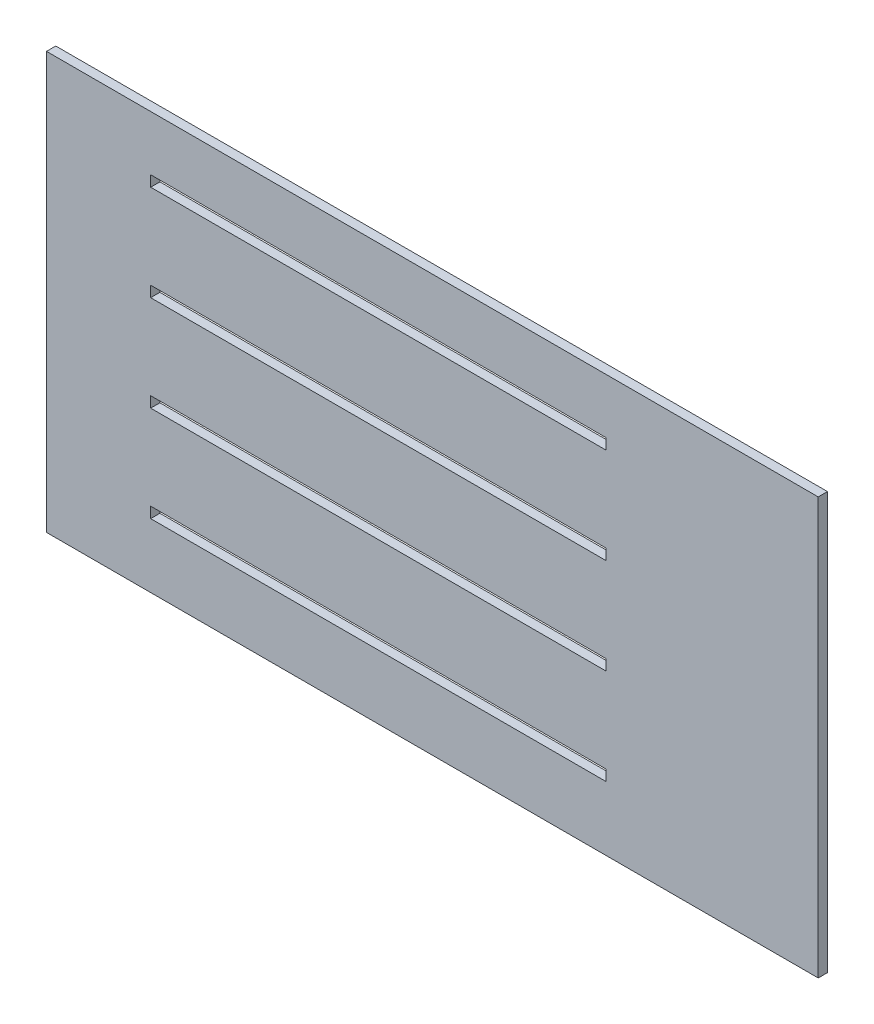
ISO-10303-21;
HEADER;
FILE_DESCRIPTION(('STEP AP214'),'2;1');
FILE_NAME('part.step','',(''),(''),'','','');
FILE_SCHEMA(('AUTOMOTIVE_DESIGN { 1 0 10303 214 1 1 1 1 }'));
ENDSEC;
DATA;
#1=APPLICATION_CONTEXT('core data for automotive mechanical design processes');
#2=APPLICATION_PROTOCOL_DEFINITION('international standard','automotive_design',2000,#1);
#3=PRODUCT_CONTEXT('',#1,'mechanical');
#4=PRODUCT('Part','Part','',(#3));
#5=PRODUCT_RELATED_PRODUCT_CATEGORY('part','',(#4));
#6=PRODUCT_DEFINITION_FORMATION('','',#4);
#7=PRODUCT_DEFINITION_CONTEXT('part definition',#1,'design');
#8=PRODUCT_DEFINITION('design','',#6,#7);
#9=PRODUCT_DEFINITION_SHAPE('','',#8);
#10=(LENGTH_UNIT() NAMED_UNIT(*) SI_UNIT(.MILLI.,.METRE.));
#11=(NAMED_UNIT(*) PLANE_ANGLE_UNIT() SI_UNIT($,.RADIAN.));
#12=(NAMED_UNIT(*) SI_UNIT($,.STERADIAN.) SOLID_ANGLE_UNIT());
#13=UNCERTAINTY_MEASURE_WITH_UNIT(LENGTH_MEASURE(1.E-05),#10,'distance_accuracy_value','');
#14=(GEOMETRIC_REPRESENTATION_CONTEXT(3) GLOBAL_UNCERTAINTY_ASSIGNED_CONTEXT((#13)) GLOBAL_UNIT_ASSIGNED_CONTEXT((#10,
#11,#12)) REPRESENTATION_CONTEXT('',''));
#15=CARTESIAN_POINT('',(0.,0.,0.));
#16=DIRECTION('',(0.,0.,1.));
#17=DIRECTION('',(1.,0.,0.));
#18=AXIS2_PLACEMENT_3D('',#15,#16,#17);
#19=CARTESIAN_POINT('',(-67.1671018276763,76.2297650130549,-3.));
#20=DIRECTION('',(0.,-1.,0.));
#21=DIRECTION('',(0.,0.,-1.));
#22=AXIS2_PLACEMENT_3D('',#19,#20,#21);
#23=PLANE('',#22);
#24=DIRECTION('',(1.,0.,0.));
#25=VECTOR('',#24,1.);
#26=CARTESIAN_POINT('',(-67.1671018276763,76.2297650130549,0.));
#27=LINE('',#26,#25);
#28=CARTESIAN_POINT('',(-101.167101827676,76.2297650130549,0.));
#29=VERTEX_POINT('',#28);
#30=CARTESIAN_POINT('',(148.894045329306,76.2297650130549,0.));
#31=VERTEX_POINT('',#30);
#32=EDGE_CURVE('E200',#29,#31,#27,.T.);
#33=ORIENTED_EDGE('',*,*,#32,.T.);
#34=DIRECTION('',(0.,0.,1.));
#35=VECTOR('',#34,1.);
#36=CARTESIAN_POINT('',(148.894045329306,76.2297650130549,-3.));
#37=LINE('',#36,#35);
#38=CARTESIAN_POINT('',(148.894045329306,76.2297650130549,-3.));
#39=VERTEX_POINT('',#38);
#40=EDGE_CURVE('E197',#39,#31,#37,.T.);
#41=ORIENTED_EDGE('',*,*,#40,.F.);
#42=DIRECTION('',(-1.,0.,0.));
#43=VECTOR('',#42,1.);
#44=CARTESIAN_POINT('',(-67.1671018276763,76.2297650130549,-3.));
#45=LINE('',#44,#43);
#46=CARTESIAN_POINT('',(-101.167101827676,76.2297650130549,-3.));
#47=VERTEX_POINT('',#46);
#48=EDGE_CURVE('E190',#39,#47,#45,.T.);
#49=ORIENTED_EDGE('',*,*,#48,.T.);
#50=DIRECTION('',(0.,0.,1.));
#51=VECTOR('',#50,1.);
#52=CARTESIAN_POINT('',(-101.167101827676,76.2297650130549,-3.));
#53=LINE('',#52,#51);
#54=EDGE_CURVE('E186',#47,#29,#53,.T.);
#55=ORIENTED_EDGE('',*,*,#54,.T.);
#56=EDGE_LOOP('',(#33,#41,#49,#55));
#57=FACE_BOUND('',#56,.T.);
#58=ADVANCED_FACE('F33',(#57),#23,.F.);
#59=CARTESIAN_POINT('',(148.894045329306,76.2297650130549,-3.));
#60=DIRECTION('',(-1.,0.,0.));
#61=DIRECTION('',(0.,0.,1.));
#62=AXIS2_PLACEMENT_3D('',#59,#60,#61);
#63=PLANE('',#62);
#64=DIRECTION('',(0.,-1.,0.));
#65=VECTOR('',#64,1.);
#66=CARTESIAN_POINT('',(148.894045329306,76.2297650130549,0.));
#67=LINE('',#66,#65);
#68=CARTESIAN_POINT('',(148.894045329306,-58.7702349869451,0.));
#69=VERTEX_POINT('',#68);
#70=EDGE_CURVE('E189',#31,#69,#67,.T.);
#71=ORIENTED_EDGE('',*,*,#70,.T.);
#72=DIRECTION('',(0.,0.,1.));
#73=VECTOR('',#72,1.);
#74=CARTESIAN_POINT('',(148.894045329306,-58.7702349869451,-3.));
#75=LINE('',#74,#73);
#76=CARTESIAN_POINT('',(148.894045329306,-58.7702349869451,-3.));
#77=VERTEX_POINT('',#76);
#78=EDGE_CURVE('E194',#77,#69,#75,.T.);
#79=ORIENTED_EDGE('',*,*,#78,.F.);
#80=DIRECTION('',(0.,-1.,0.));
#81=VECTOR('',#80,1.);
#82=CARTESIAN_POINT('',(148.894045329306,76.2297650130549,-3.));
#83=LINE('',#82,#81);
#84=EDGE_CURVE('E213',#39,#77,#83,.T.);
#85=ORIENTED_EDGE('',*,*,#84,.F.);
#86=ORIENTED_EDGE('',*,*,#40,.T.);
#87=EDGE_LOOP('',(#71,#79,#85,#86));
#88=FACE_BOUND('',#87,.T.);
#89=ADVANCED_FACE('F374',(#88),#63,.F.);
#90=CARTESIAN_POINT('',(79.8940453293061,-58.7702349869451,-3.));
#91=DIRECTION('',(0.,-1.,0.));
#92=DIRECTION('',(0.,0.,-1.));
#93=AXIS2_PLACEMENT_3D('',#90,#91,#92);
#94=PLANE('',#93);
#95=DIRECTION('',(1.,0.,0.));
#96=VECTOR('',#95,1.);
#97=CARTESIAN_POINT('',(79.8940453293061,-58.7702349869451,0.));
#98=LINE('',#97,#96);
#99=CARTESIAN_POINT('',(-101.167101827676,-58.7702349869451,0.));
#100=VERTEX_POINT('',#99);
#101=EDGE_CURVE('E205',#100,#69,#98,.T.);
#102=ORIENTED_EDGE('',*,*,#101,.F.);
#103=DIRECTION('',(0.,0.,1.));
#104=VECTOR('',#103,1.);
#105=CARTESIAN_POINT('',(-101.167101827676,-58.7702349869451,-3.));
#106=LINE('',#105,#104);
#107=CARTESIAN_POINT('',(-101.167101827676,-58.7702349869451,-3.));
#108=VERTEX_POINT('',#107);
#109=EDGE_CURVE('E96',#108,#100,#106,.T.);
#110=ORIENTED_EDGE('',*,*,#109,.F.);
#111=DIRECTION('',(-1.,0.,0.));
#112=VECTOR('',#111,1.);
#113=CARTESIAN_POINT('',(-98.1671018276762,-58.7702349869451,-3.));
#114=LINE('',#113,#112);
#115=EDGE_CURVE('E212',#77,#108,#114,.T.);
#116=ORIENTED_EDGE('',*,*,#115,.F.);
#117=ORIENTED_EDGE('',*,*,#78,.T.);
#118=EDGE_LOOP('',(#102,#110,#116,#117));
#119=FACE_BOUND('',#118,.T.);
#120=ADVANCED_FACE('F380',(#119),#94,.T.);
#121=CARTESIAN_POINT('',(-101.167101827676,76.2297650130549,-3.));
#122=DIRECTION('',(-1.,0.,0.));
#123=DIRECTION('',(0.,-1.,0.));
#124=AXIS2_PLACEMENT_3D('',#121,#122,#123);
#125=PLANE('',#124);
#126=DIRECTION('',(0.,-1.,0.));
#127=VECTOR('',#126,1.);
#128=CARTESIAN_POINT('',(-101.167101827676,76.2297650130549,0.));
#129=LINE('',#128,#127);
#130=EDGE_CURVE('E209',#29,#100,#129,.T.);
#131=ORIENTED_EDGE('',*,*,#130,.F.);
#132=ORIENTED_EDGE('',*,*,#54,.F.);
#133=DIRECTION('',(0.,-1.,0.));
#134=VECTOR('',#133,1.);
#135=CARTESIAN_POINT('',(-101.167101827676,76.2297650130549,-3.));
#136=LINE('',#135,#134);
#137=EDGE_CURVE('E193',#47,#108,#136,.T.);
#138=ORIENTED_EDGE('',*,*,#137,.T.);
#139=ORIENTED_EDGE('',*,*,#109,.T.);
#140=EDGE_LOOP('',(#131,#132,#138,#139));
#141=FACE_BOUND('',#140,.T.);
#142=ADVANCED_FACE('F388',(#141),#125,.T.);
#143=CARTESIAN_POINT('',(0.,0.,-3.));
#144=DIRECTION('',(0.,0.,1.));
#145=DIRECTION('',(1.,0.,0.));
#146=AXIS2_PLACEMENT_3D('',#143,#144,#145);
#147=PLANE('',#146);
#148=DIRECTION('',(-1.,0.,0.));
#149=VECTOR('',#148,1.);
#150=CARTESIAN_POINT('',(-67.4171018276762,27.4797650130548,-3.));
#151=LINE('',#150,#149);
#152=CARTESIAN_POINT('',(80.0828981723238,27.4797650130548,-3.));
#153=VERTEX_POINT('',#152);
#154=CARTESIAN_POINT('',(-67.4171018276762,27.4797650130548,-3.));
#155=VERTEX_POINT('',#154);
#156=EDGE_CURVE('E74',#153,#155,#151,.T.);
#157=ORIENTED_EDGE('',*,*,#156,.T.);
#158=DIRECTION('',(0.,-1.,0.));
#159=VECTOR('',#158,1.);
#160=CARTESIAN_POINT('',(-67.4171018276762,27.4797650130548,-3.));
#161=LINE('',#160,#159);
#162=CARTESIAN_POINT('',(-67.4171018276762,23.9797650130548,-3.));
#163=VERTEX_POINT('',#162);
#164=EDGE_CURVE('E37',#155,#163,#161,.T.);
#165=ORIENTED_EDGE('',*,*,#164,.T.);
#166=DIRECTION('',(1.,0.,0.));
#167=VECTOR('',#166,1.);
#168=CARTESIAN_POINT('',(-67.4171018276762,23.9797650130548,-3.));
#169=LINE('',#168,#167);
#170=CARTESIAN_POINT('',(80.0828981723237,23.9797650130548,-3.));
#171=VERTEX_POINT('',#170);
#172=EDGE_CURVE('E99',#163,#171,#169,.T.);
#173=ORIENTED_EDGE('',*,*,#172,.T.);
#174=DIRECTION('',(0.,1.,0.));
#175=VECTOR('',#174,1.);
#176=CARTESIAN_POINT('',(80.0828981723238,27.4797650130548,-3.));
#177=LINE('',#176,#175);
#178=EDGE_CURVE('E97',#171,#153,#177,.T.);
#179=ORIENTED_EDGE('',*,*,#178,.T.);
#180=EDGE_LOOP('',(#157,#165,#173,#179));
#181=FACE_BOUND('',#180,.T.);
#182=DIRECTION('',(-1.,0.,0.));
#183=VECTOR('',#182,1.);
#184=CARTESIAN_POINT('',(-67.4171018276762,-3.52023498694516,-3.));
#185=LINE('',#184,#183);
#186=CARTESIAN_POINT('',(80.0828981723238,-3.52023498694516,-3.));
#187=VERTEX_POINT('',#186);
#188=CARTESIAN_POINT('',(-67.4171018276762,-3.52023498694516,-3.));
#189=VERTEX_POINT('',#188);
#190=EDGE_CURVE('E98',#187,#189,#185,.T.);
#191=ORIENTED_EDGE('',*,*,#190,.T.);
#192=DIRECTION('',(0.,-1.,0.));
#193=VECTOR('',#192,1.);
#194=CARTESIAN_POINT('',(-67.4171018276762,-3.52023498694516,-3.));
#195=LINE('',#194,#193);
#196=CARTESIAN_POINT('',(-67.4171018276762,-7.02023498694514,-3.));
#197=VERTEX_POINT('',#196);
#198=EDGE_CURVE('E114',#189,#197,#195,.T.);
#199=ORIENTED_EDGE('',*,*,#198,.T.);
#200=DIRECTION('',(1.,0.,0.));
#201=VECTOR('',#200,1.);
#202=CARTESIAN_POINT('',(-67.4171018276762,-7.02023498694514,-3.));
#203=LINE('',#202,#201);
#204=CARTESIAN_POINT('',(80.0828981723237,-7.02023498694514,-3.));
#205=VERTEX_POINT('',#204);
#206=EDGE_CURVE('E117',#197,#205,#203,.T.);
#207=ORIENTED_EDGE('',*,*,#206,.T.);
#208=DIRECTION('',(0.,1.,0.));
#209=VECTOR('',#208,1.);
#210=CARTESIAN_POINT('',(80.0828981723238,-3.52023498694516,-3.));
#211=LINE('',#210,#209);
#212=EDGE_CURVE('E120',#205,#187,#211,.T.);
#213=ORIENTED_EDGE('',*,*,#212,.T.);
#214=EDGE_LOOP('',(#191,#199,#207,#213));
#215=FACE_BOUND('',#214,.T.);
#216=DIRECTION('',(-1.,0.,0.));
#217=VECTOR('',#216,1.);
#218=CARTESIAN_POINT('',(-67.4171018276762,-34.5202349869452,-3.));
#219=LINE('',#218,#217);
#220=CARTESIAN_POINT('',(80.0828981723237,-34.5202349869452,-3.));
#221=VERTEX_POINT('',#220);
#222=CARTESIAN_POINT('',(-67.4171018276762,-34.5202349869452,-3.));
#223=VERTEX_POINT('',#222);
#224=EDGE_CURVE('E123',#221,#223,#219,.T.);
#225=ORIENTED_EDGE('',*,*,#224,.T.);
#226=DIRECTION('',(0.,-1.,0.));
#227=VECTOR('',#226,1.);
#228=CARTESIAN_POINT('',(-67.4171018276762,-34.5202349869452,-3.));
#229=LINE('',#228,#227);
#230=CARTESIAN_POINT('',(-67.4171018276762,-38.0202349869451,-3.));
#231=VERTEX_POINT('',#230);
#232=EDGE_CURVE('E150',#223,#231,#229,.T.);
#233=ORIENTED_EDGE('',*,*,#232,.T.);
#234=DIRECTION('',(1.,0.,0.));
#235=VECTOR('',#234,1.);
#236=CARTESIAN_POINT('',(-67.4171018276762,-38.0202349869451,-3.));
#237=LINE('',#236,#235);
#238=CARTESIAN_POINT('',(80.0828981723237,-38.0202349869451,-3.));
#239=VERTEX_POINT('',#238);
#240=EDGE_CURVE('E153',#231,#239,#237,.T.);
#241=ORIENTED_EDGE('',*,*,#240,.T.);
#242=DIRECTION('',(0.,1.,0.));
#243=VECTOR('',#242,1.);
#244=CARTESIAN_POINT('',(80.0828981723237,-34.5202349869452,-3.));
#245=LINE('',#244,#243);
#246=EDGE_CURVE('E156',#239,#221,#245,.T.);
#247=ORIENTED_EDGE('',*,*,#246,.T.);
#248=EDGE_LOOP('',(#225,#233,#241,#247));
#249=FACE_BOUND('',#248,.T.);
#250=DIRECTION('',(-1.,0.,0.));
#251=VECTOR('',#250,1.);
#252=CARTESIAN_POINT('',(-67.4171018276762,58.4797650130549,-3.));
#253=LINE('',#252,#251);
#254=CARTESIAN_POINT('',(80.0828981723238,58.4797650130549,-3.));
#255=VERTEX_POINT('',#254);
#256=CARTESIAN_POINT('',(-67.4171018276762,58.4797650130549,-3.));
#257=VERTEX_POINT('',#256);
#258=EDGE_CURVE('E159',#255,#257,#253,.T.);
#259=ORIENTED_EDGE('',*,*,#258,.T.);
#260=DIRECTION('',(0.,-1.,0.));
#261=VECTOR('',#260,1.);
#262=CARTESIAN_POINT('',(-67.4171018276762,58.4797650130549,-3.));
#263=LINE('',#262,#261);
#264=CARTESIAN_POINT('',(-67.4171018276762,54.9797650130549,-3.));
#265=VERTEX_POINT('',#264);
#266=EDGE_CURVE('E247',#257,#265,#263,.T.);
#267=ORIENTED_EDGE('',*,*,#266,.T.);
#268=DIRECTION('',(1.,0.,0.));
#269=VECTOR('',#268,1.);
#270=CARTESIAN_POINT('',(-67.4171018276762,54.9797650130549,-3.));
#271=LINE('',#270,#269);
#272=CARTESIAN_POINT('',(80.0828981723237,54.9797650130549,-3.));
#273=VERTEX_POINT('',#272);
#274=EDGE_CURVE('E250',#265,#273,#271,.T.);
#275=ORIENTED_EDGE('',*,*,#274,.T.);
#276=DIRECTION('',(0.,1.,0.));
#277=VECTOR('',#276,1.);
#278=CARTESIAN_POINT('',(80.0828981723238,58.4797650130549,-3.));
#279=LINE('',#278,#277);
#280=EDGE_CURVE('E216',#273,#255,#279,.T.);
#281=ORIENTED_EDGE('',*,*,#280,.T.);
#282=EDGE_LOOP('',(#259,#267,#275,#281));
#283=FACE_BOUND('',#282,.T.);
#284=ORIENTED_EDGE('',*,*,#48,.F.);
#285=ORIENTED_EDGE('',*,*,#84,.T.);
#286=ORIENTED_EDGE('',*,*,#115,.T.);
#287=ORIENTED_EDGE('',*,*,#137,.F.);
#288=EDGE_LOOP('',(#284,#285,#286,#287));
#289=FACE_BOUND('',#288,.T.);
#290=ADVANCED_FACE('F35',(#181,#215,#249,#283,#289),#147,.F.);
#291=CARTESIAN_POINT('',(0.,0.,0.));
#292=DIRECTION('',(0.,0.,1.));
#293=DIRECTION('',(1.,0.,0.));
#294=AXIS2_PLACEMENT_3D('',#291,#292,#293);
#295=PLANE('',#294);
#296=DIRECTION('',(0.,-1.,0.));
#297=VECTOR('',#296,1.);
#298=CARTESIAN_POINT('',(-67.4171018276762,27.4797650130548,0.));
#299=LINE('',#298,#297);
#300=CARTESIAN_POINT('',(-67.4171018276762,27.4797650130548,0.));
#301=VERTEX_POINT('',#300);
#302=CARTESIAN_POINT('',(-67.4171018276762,23.9797650130548,0.));
#303=VERTEX_POINT('',#302);
#304=EDGE_CURVE('E86',#301,#303,#299,.T.);
#305=ORIENTED_EDGE('',*,*,#304,.F.);
#306=DIRECTION('',(-1.,0.,0.));
#307=VECTOR('',#306,1.);
#308=CARTESIAN_POINT('',(-67.4171018276762,27.4797650130548,0.));
#309=LINE('',#308,#307);
#310=CARTESIAN_POINT('',(80.0828981723238,27.4797650130548,0.));
#311=VERTEX_POINT('',#310);
#312=EDGE_CURVE('E71',#311,#301,#309,.T.);
#313=ORIENTED_EDGE('',*,*,#312,.F.);
#314=DIRECTION('',(0.,1.,0.));
#315=VECTOR('',#314,1.);
#316=CARTESIAN_POINT('',(80.0828981723238,27.4797650130548,0.));
#317=LINE('',#316,#315);
#318=CARTESIAN_POINT('',(80.0828981723237,23.9797650130548,0.));
#319=VERTEX_POINT('',#318);
#320=EDGE_CURVE('E76',#319,#311,#317,.T.);
#321=ORIENTED_EDGE('',*,*,#320,.F.);
#322=DIRECTION('',(1.,0.,0.));
#323=VECTOR('',#322,1.);
#324=CARTESIAN_POINT('',(-67.4171018276762,23.9797650130548,0.));
#325=LINE('',#324,#323);
#326=EDGE_CURVE('E43',#303,#319,#325,.T.);
#327=ORIENTED_EDGE('',*,*,#326,.F.);
#328=EDGE_LOOP('',(#305,#313,#321,#327));
#329=FACE_BOUND('',#328,.T.);
#330=DIRECTION('',(0.,-1.,0.));
#331=VECTOR('',#330,1.);
#332=CARTESIAN_POINT('',(-67.4171018276762,-3.52023498694516,0.));
#333=LINE('',#332,#331);
#334=CARTESIAN_POINT('',(-67.4171018276762,-3.52023498694516,0.));
#335=VERTEX_POINT('',#334);
#336=CARTESIAN_POINT('',(-67.4171018276762,-7.02023498694514,0.));
#337=VERTEX_POINT('',#336);
#338=EDGE_CURVE('E126',#335,#337,#333,.T.);
#339=ORIENTED_EDGE('',*,*,#338,.F.);
#340=DIRECTION('',(-1.,0.,0.));
#341=VECTOR('',#340,1.);
#342=CARTESIAN_POINT('',(-67.4171018276762,-3.52023498694516,0.));
#343=LINE('',#342,#341);
#344=CARTESIAN_POINT('',(80.0828981723238,-3.52023498694516,0.));
#345=VERTEX_POINT('',#344);
#346=EDGE_CURVE('E139',#345,#335,#343,.T.);
#347=ORIENTED_EDGE('',*,*,#346,.F.);
#348=DIRECTION('',(0.,1.,0.));
#349=VECTOR('',#348,1.);
#350=CARTESIAN_POINT('',(80.0828981723238,-3.52023498694516,0.));
#351=LINE('',#350,#349);
#352=CARTESIAN_POINT('',(80.0828981723237,-7.02023498694514,0.));
#353=VERTEX_POINT('',#352);
#354=EDGE_CURVE('E135',#353,#345,#351,.T.);
#355=ORIENTED_EDGE('',*,*,#354,.F.);
#356=DIRECTION('',(1.,0.,0.));
#357=VECTOR('',#356,1.);
#358=CARTESIAN_POINT('',(-67.4171018276762,-7.02023498694514,0.));
#359=LINE('',#358,#357);
#360=EDGE_CURVE('E131',#337,#353,#359,.T.);
#361=ORIENTED_EDGE('',*,*,#360,.F.);
#362=EDGE_LOOP('',(#339,#347,#355,#361));
#363=FACE_BOUND('',#362,.T.);
#364=DIRECTION('',(0.,-1.,0.));
#365=VECTOR('',#364,1.);
#366=CARTESIAN_POINT('',(-67.4171018276762,-34.5202349869452,0.));
#367=LINE('',#366,#365);
#368=CARTESIAN_POINT('',(-67.4171018276762,-34.5202349869452,0.));
#369=VERTEX_POINT('',#368);
#370=CARTESIAN_POINT('',(-67.4171018276762,-38.0202349869451,0.));
#371=VERTEX_POINT('',#370);
#372=EDGE_CURVE('E162',#369,#371,#367,.T.);
#373=ORIENTED_EDGE('',*,*,#372,.F.);
#374=DIRECTION('',(-1.,0.,0.));
#375=VECTOR('',#374,1.);
#376=CARTESIAN_POINT('',(-67.4171018276762,-34.5202349869452,0.));
#377=LINE('',#376,#375);
#378=CARTESIAN_POINT('',(80.0828981723237,-34.5202349869452,0.));
#379=VERTEX_POINT('',#378);
#380=EDGE_CURVE('E175',#379,#369,#377,.T.);
#381=ORIENTED_EDGE('',*,*,#380,.F.);
#382=DIRECTION('',(0.,1.,0.));
#383=VECTOR('',#382,1.);
#384=CARTESIAN_POINT('',(80.0828981723237,-34.5202349869452,0.));
#385=LINE('',#384,#383);
#386=CARTESIAN_POINT('',(80.0828981723237,-38.0202349869451,0.));
#387=VERTEX_POINT('',#386);
#388=EDGE_CURVE('E171',#387,#379,#385,.T.);
#389=ORIENTED_EDGE('',*,*,#388,.F.);
#390=DIRECTION('',(1.,0.,0.));
#391=VECTOR('',#390,1.);
#392=CARTESIAN_POINT('',(-67.4171018276762,-38.0202349869451,0.));
#393=LINE('',#392,#391);
#394=EDGE_CURVE('E167',#371,#387,#393,.T.);
#395=ORIENTED_EDGE('',*,*,#394,.F.);
#396=EDGE_LOOP('',(#373,#381,#389,#395));
#397=FACE_BOUND('',#396,.T.);
#398=DIRECTION('',(0.,-1.,0.));
#399=VECTOR('',#398,1.);
#400=CARTESIAN_POINT('',(-67.4171018276762,58.4797650130549,0.));
#401=LINE('',#400,#399);
#402=CARTESIAN_POINT('',(-67.4171018276762,58.4797650130549,0.));
#403=VERTEX_POINT('',#402);
#404=CARTESIAN_POINT('',(-67.4171018276762,54.9797650130549,0.));
#405=VERTEX_POINT('',#404);
#406=EDGE_CURVE('E208',#403,#405,#401,.T.);
#407=ORIENTED_EDGE('',*,*,#406,.F.);
#408=DIRECTION('',(-1.,0.,0.));
#409=VECTOR('',#408,1.);
#410=CARTESIAN_POINT('',(-67.4171018276762,58.4797650130549,0.));
#411=LINE('',#410,#409);
#412=CARTESIAN_POINT('',(80.0828981723238,58.4797650130549,0.));
#413=VERTEX_POINT('',#412);
#414=EDGE_CURVE('E233',#413,#403,#411,.T.);
#415=ORIENTED_EDGE('',*,*,#414,.F.);
#416=DIRECTION('',(0.,1.,0.));
#417=VECTOR('',#416,1.);
#418=CARTESIAN_POINT('',(80.0828981723238,58.4797650130549,0.));
#419=LINE('',#418,#417);
#420=CARTESIAN_POINT('',(80.0828981723237,54.9797650130549,0.));
#421=VERTEX_POINT('',#420);
#422=EDGE_CURVE('E229',#421,#413,#419,.T.);
#423=ORIENTED_EDGE('',*,*,#422,.F.);
#424=DIRECTION('',(1.,0.,0.));
#425=VECTOR('',#424,1.);
#426=CARTESIAN_POINT('',(-67.4171018276762,54.9797650130549,0.));
#427=LINE('',#426,#425);
#428=EDGE_CURVE('E225',#405,#421,#427,.T.);
#429=ORIENTED_EDGE('',*,*,#428,.F.);
#430=EDGE_LOOP('',(#407,#415,#423,#429));
#431=FACE_BOUND('',#430,.T.);
#432=ORIENTED_EDGE('',*,*,#32,.F.);
#433=ORIENTED_EDGE('',*,*,#130,.T.);
#434=ORIENTED_EDGE('',*,*,#101,.T.);
#435=ORIENTED_EDGE('',*,*,#70,.F.);
#436=EDGE_LOOP('',(#432,#433,#434,#435));
#437=FACE_BOUND('',#436,.T.);
#438=ADVANCED_FACE('F83',(#329,#363,#397,#431,#437),#295,.T.);
#439=CARTESIAN_POINT('',(-67.4171018276762,58.4797650130549,-3.));
#440=DIRECTION('',(-1.,0.,0.));
#441=DIRECTION('',(0.,0.,1.));
#442=AXIS2_PLACEMENT_3D('',#439,#440,#441);
#443=PLANE('',#442);
#444=ORIENTED_EDGE('',*,*,#406,.T.);
#445=DIRECTION('',(0.,0.,1.));
#446=VECTOR('',#445,1.);
#447=CARTESIAN_POINT('',(-67.4171018276762,54.9797650130549,-3.));
#448=LINE('',#447,#446);
#449=EDGE_CURVE('E166',#265,#405,#448,.T.);
#450=ORIENTED_EDGE('',*,*,#449,.F.);
#451=ORIENTED_EDGE('',*,*,#266,.F.);
#452=DIRECTION('',(0.,0.,1.));
#453=VECTOR('',#452,1.);
#454=CARTESIAN_POINT('',(-67.4171018276762,58.4797650130549,-3.));
#455=LINE('',#454,#453);
#456=EDGE_CURVE('E234',#257,#403,#455,.T.);
#457=ORIENTED_EDGE('',*,*,#456,.T.);
#458=EDGE_LOOP('',(#444,#450,#451,#457));
#459=FACE_BOUND('',#458,.T.);
#460=ADVANCED_FACE('F267',(#459),#443,.F.);
#461=CARTESIAN_POINT('',(-67.4171018276762,58.4797650130549,-3.));
#462=DIRECTION('',(0.,1.,0.));
#463=DIRECTION('',(0.,0.,1.));
#464=AXIS2_PLACEMENT_3D('',#461,#462,#463);
#465=PLANE('',#464);
#466=ORIENTED_EDGE('',*,*,#414,.T.);
#467=ORIENTED_EDGE('',*,*,#456,.F.);
#468=ORIENTED_EDGE('',*,*,#258,.F.);
#469=DIRECTION('',(0.,0.,1.));
#470=VECTOR('',#469,1.);
#471=CARTESIAN_POINT('',(80.0828981723238,58.4797650130549,-3.));
#472=LINE('',#471,#470);
#473=EDGE_CURVE('E230',#255,#413,#472,.T.);
#474=ORIENTED_EDGE('',*,*,#473,.T.);
#475=EDGE_LOOP('',(#466,#467,#468,#474));
#476=FACE_BOUND('',#475,.T.);
#477=ADVANCED_FACE('F425',(#476),#465,.F.);
#478=CARTESIAN_POINT('',(80.0828981723238,58.4797650130549,-3.));
#479=DIRECTION('',(1.,0.,0.));
#480=DIRECTION('',(0.,1.,0.));
#481=AXIS2_PLACEMENT_3D('',#478,#479,#480);
#482=PLANE('',#481);
#483=ORIENTED_EDGE('',*,*,#422,.T.);
#484=ORIENTED_EDGE('',*,*,#473,.F.);
#485=ORIENTED_EDGE('',*,*,#280,.F.);
#486=DIRECTION('',(0.,0.,1.));
#487=VECTOR('',#486,1.);
#488=CARTESIAN_POINT('',(80.0828981723237,54.9797650130549,-3.));
#489=LINE('',#488,#487);
#490=EDGE_CURVE('E226',#273,#421,#489,.T.);
#491=ORIENTED_EDGE('',*,*,#490,.T.);
#492=EDGE_LOOP('',(#483,#484,#485,#491));
#493=FACE_BOUND('',#492,.T.);
#494=ADVANCED_FACE('F493',(#493),#482,.F.);
#495=CARTESIAN_POINT('',(-67.4171018276762,54.9797650130549,-3.));
#496=DIRECTION('',(0.,-1.,0.));
#497=DIRECTION('',(0.,0.,-1.));
#498=AXIS2_PLACEMENT_3D('',#495,#496,#497);
#499=PLANE('',#498);
#500=ORIENTED_EDGE('',*,*,#428,.T.);
#501=ORIENTED_EDGE('',*,*,#490,.F.);
#502=ORIENTED_EDGE('',*,*,#274,.F.);
#503=ORIENTED_EDGE('',*,*,#449,.T.);
#504=EDGE_LOOP('',(#500,#501,#502,#503));
#505=FACE_BOUND('',#504,.T.);
#506=ADVANCED_FACE('F370',(#505),#499,.F.);
#507=CARTESIAN_POINT('',(-67.4171018276762,-34.5202349869452,-3.));
#508=DIRECTION('',(-1.,0.,0.));
#509=DIRECTION('',(0.,0.,1.));
#510=AXIS2_PLACEMENT_3D('',#507,#508,#509);
#511=PLANE('',#510);
#512=ORIENTED_EDGE('',*,*,#372,.T.);
#513=DIRECTION('',(0.,0.,1.));
#514=VECTOR('',#513,1.);
#515=CARTESIAN_POINT('',(-67.4171018276762,-38.0202349869451,-3.));
#516=LINE('',#515,#514);
#517=EDGE_CURVE('E130',#231,#371,#516,.T.);
#518=ORIENTED_EDGE('',*,*,#517,.F.);
#519=ORIENTED_EDGE('',*,*,#232,.F.);
#520=DIRECTION('',(0.,0.,1.));
#521=VECTOR('',#520,1.);
#522=CARTESIAN_POINT('',(-67.4171018276762,-34.5202349869452,-3.));
#523=LINE('',#522,#521);
#524=EDGE_CURVE('E165',#223,#369,#523,.T.);
#525=ORIENTED_EDGE('',*,*,#524,.T.);
#526=EDGE_LOOP('',(#512,#518,#519,#525));
#527=FACE_BOUND('',#526,.T.);
#528=ADVANCED_FACE('F345',(#527),#511,.F.);
#529=CARTESIAN_POINT('',(-67.4171018276762,-34.5202349869452,-3.));
#530=DIRECTION('',(0.,1.,0.));
#531=DIRECTION('',(0.,0.,1.));
#532=AXIS2_PLACEMENT_3D('',#529,#530,#531);
#533=PLANE('',#532);
#534=ORIENTED_EDGE('',*,*,#380,.T.);
#535=ORIENTED_EDGE('',*,*,#524,.F.);
#536=ORIENTED_EDGE('',*,*,#224,.F.);
#537=DIRECTION('',(0.,0.,1.));
#538=VECTOR('',#537,1.);
#539=CARTESIAN_POINT('',(80.0828981723237,-34.5202349869452,-3.));
#540=LINE('',#539,#538);
#541=EDGE_CURVE('E174',#221,#379,#540,.T.);
#542=ORIENTED_EDGE('',*,*,#541,.T.);
#543=EDGE_LOOP('',(#534,#535,#536,#542));
#544=FACE_BOUND('',#543,.T.);
#545=ADVANCED_FACE('F362',(#544),#533,.F.);
#546=CARTESIAN_POINT('',(80.0828981723237,-34.5202349869452,-3.));
#547=DIRECTION('',(1.,0.,0.));
#548=DIRECTION('',(0.,1.,0.));
#549=AXIS2_PLACEMENT_3D('',#546,#547,#548);
#550=PLANE('',#549);
#551=ORIENTED_EDGE('',*,*,#388,.T.);
#552=ORIENTED_EDGE('',*,*,#541,.F.);
#553=ORIENTED_EDGE('',*,*,#246,.F.);
#554=DIRECTION('',(0.,0.,1.));
#555=VECTOR('',#554,1.);
#556=CARTESIAN_POINT('',(80.0828981723237,-38.0202349869451,-3.));
#557=LINE('',#556,#555);
#558=EDGE_CURVE('E170',#239,#387,#557,.T.);
#559=ORIENTED_EDGE('',*,*,#558,.T.);
#560=EDGE_LOOP('',(#551,#552,#553,#559));
#561=FACE_BOUND('',#560,.T.);
#562=ADVANCED_FACE('F357',(#561),#550,.F.);
#563=CARTESIAN_POINT('',(-67.4171018276762,-38.0202349869451,-3.));
#564=DIRECTION('',(0.,-1.,0.));
#565=DIRECTION('',(0.,0.,-1.));
#566=AXIS2_PLACEMENT_3D('',#563,#564,#565);
#567=PLANE('',#566);
#568=ORIENTED_EDGE('',*,*,#394,.T.);
#569=ORIENTED_EDGE('',*,*,#558,.F.);
#570=ORIENTED_EDGE('',*,*,#240,.F.);
#571=ORIENTED_EDGE('',*,*,#517,.T.);
#572=EDGE_LOOP('',(#568,#569,#570,#571));
#573=FACE_BOUND('',#572,.T.);
#574=ADVANCED_FACE('F352',(#573),#567,.F.);
#575=CARTESIAN_POINT('',(-67.4171018276762,-3.52023498694516,-3.));
#576=DIRECTION('',(-1.,0.,0.));
#577=DIRECTION('',(0.,0.,1.));
#578=AXIS2_PLACEMENT_3D('',#575,#576,#577);
#579=PLANE('',#578);
#580=ORIENTED_EDGE('',*,*,#338,.T.);
#581=DIRECTION('',(0.,0.,1.));
#582=VECTOR('',#581,1.);
#583=CARTESIAN_POINT('',(-67.4171018276762,-7.02023498694514,-3.));
#584=LINE('',#583,#582);
#585=EDGE_CURVE('E94',#197,#337,#584,.T.);
#586=ORIENTED_EDGE('',*,*,#585,.F.);
#587=ORIENTED_EDGE('',*,*,#198,.F.);
#588=DIRECTION('',(0.,0.,1.));
#589=VECTOR('',#588,1.);
#590=CARTESIAN_POINT('',(-67.4171018276762,-3.52023498694516,-3.));
#591=LINE('',#590,#589);
#592=EDGE_CURVE('E129',#189,#335,#591,.T.);
#593=ORIENTED_EDGE('',*,*,#592,.T.);
#594=EDGE_LOOP('',(#580,#586,#587,#593));
#595=FACE_BOUND('',#594,.T.);
#596=ADVANCED_FACE('F394',(#595),#579,.F.);
#597=CARTESIAN_POINT('',(-67.4171018276762,-3.52023498694516,-3.));
#598=DIRECTION('',(0.,1.,0.));
#599=DIRECTION('',(0.,0.,1.));
#600=AXIS2_PLACEMENT_3D('',#597,#598,#599);
#601=PLANE('',#600);
#602=ORIENTED_EDGE('',*,*,#346,.T.);
#603=ORIENTED_EDGE('',*,*,#592,.F.);
#604=ORIENTED_EDGE('',*,*,#190,.F.);
#605=DIRECTION('',(0.,0.,1.));
#606=VECTOR('',#605,1.);
#607=CARTESIAN_POINT('',(80.0828981723238,-3.52023498694516,-3.));
#608=LINE('',#607,#606);
#609=EDGE_CURVE('E138',#187,#345,#608,.T.);
#610=ORIENTED_EDGE('',*,*,#609,.T.);
#611=EDGE_LOOP('',(#602,#603,#604,#610));
#612=FACE_BOUND('',#611,.T.);
#613=ADVANCED_FACE('F398',(#612),#601,.F.);
#614=CARTESIAN_POINT('',(80.0828981723238,-3.52023498694516,-3.));
#615=DIRECTION('',(1.,0.,0.));
#616=DIRECTION('',(0.,1.,0.));
#617=AXIS2_PLACEMENT_3D('',#614,#615,#616);
#618=PLANE('',#617);
#619=ORIENTED_EDGE('',*,*,#354,.T.);
#620=ORIENTED_EDGE('',*,*,#609,.F.);
#621=ORIENTED_EDGE('',*,*,#212,.F.);
#622=DIRECTION('',(0.,0.,1.));
#623=VECTOR('',#622,1.);
#624=CARTESIAN_POINT('',(80.0828981723237,-7.02023498694514,-3.));
#625=LINE('',#624,#623);
#626=EDGE_CURVE('E134',#205,#353,#625,.T.);
#627=ORIENTED_EDGE('',*,*,#626,.T.);
#628=EDGE_LOOP('',(#619,#620,#621,#627));
#629=FACE_BOUND('',#628,.T.);
#630=ADVANCED_FACE('F402',(#629),#618,.F.);
#631=CARTESIAN_POINT('',(-67.4171018276762,-7.02023498694514,-3.));
#632=DIRECTION('',(0.,-1.,0.));
#633=DIRECTION('',(0.,0.,-1.));
#634=AXIS2_PLACEMENT_3D('',#631,#632,#633);
#635=PLANE('',#634);
#636=ORIENTED_EDGE('',*,*,#360,.T.);
#637=ORIENTED_EDGE('',*,*,#626,.F.);
#638=ORIENTED_EDGE('',*,*,#206,.F.);
#639=ORIENTED_EDGE('',*,*,#585,.T.);
#640=EDGE_LOOP('',(#636,#637,#638,#639));
#641=FACE_BOUND('',#640,.T.);
#642=ADVANCED_FACE('F406',(#641),#635,.F.);
#643=CARTESIAN_POINT('',(-67.4171018276762,27.4797650130548,-3.));
#644=DIRECTION('',(-1.,0.,0.));
#645=DIRECTION('',(0.,0.,1.));
#646=AXIS2_PLACEMENT_3D('',#643,#644,#645);
#647=PLANE('',#646);
#648=ORIENTED_EDGE('',*,*,#304,.T.);
#649=DIRECTION('',(0.,0.,1.));
#650=VECTOR('',#649,1.);
#651=CARTESIAN_POINT('',(-67.4171018276762,23.9797650130548,-3.));
#652=LINE('',#651,#650);
#653=EDGE_CURVE('E11',#163,#303,#652,.T.);
#654=ORIENTED_EDGE('',*,*,#653,.F.);
#655=ORIENTED_EDGE('',*,*,#164,.F.);
#656=DIRECTION('',(0.,0.,1.));
#657=VECTOR('',#656,1.);
#658=CARTESIAN_POINT('',(-67.4171018276762,27.4797650130548,-3.));
#659=LINE('',#658,#657);
#660=EDGE_CURVE('E87',#155,#301,#659,.T.);
#661=ORIENTED_EDGE('',*,*,#660,.T.);
#662=EDGE_LOOP('',(#648,#654,#655,#661));
#663=FACE_BOUND('',#662,.T.);
#664=ADVANCED_FACE('F109',(#663),#647,.F.);
#665=CARTESIAN_POINT('',(-67.4171018276762,27.4797650130548,-3.));
#666=DIRECTION('',(0.,1.,0.));
#667=DIRECTION('',(0.,0.,1.));
#668=AXIS2_PLACEMENT_3D('',#665,#666,#667);
#669=PLANE('',#668);
#670=ORIENTED_EDGE('',*,*,#312,.T.);
#671=ORIENTED_EDGE('',*,*,#660,.F.);
#672=ORIENTED_EDGE('',*,*,#156,.F.);
#673=DIRECTION('',(0.,0.,1.));
#674=VECTOR('',#673,1.);
#675=CARTESIAN_POINT('',(80.0828981723238,27.4797650130548,-3.));
#676=LINE('',#675,#674);
#677=EDGE_CURVE('E65',#153,#311,#676,.T.);
#678=ORIENTED_EDGE('',*,*,#677,.T.);
#679=EDGE_LOOP('',(#670,#671,#672,#678));
#680=FACE_BOUND('',#679,.T.);
#681=ADVANCED_FACE('F69',(#680),#669,.F.);
#682=CARTESIAN_POINT('',(80.0828981723238,27.4797650130548,-3.));
#683=DIRECTION('',(1.,0.,0.));
#684=DIRECTION('',(0.,1.,0.));
#685=AXIS2_PLACEMENT_3D('',#682,#683,#684);
#686=PLANE('',#685);
#687=ORIENTED_EDGE('',*,*,#320,.T.);
#688=ORIENTED_EDGE('',*,*,#677,.F.);
#689=ORIENTED_EDGE('',*,*,#178,.F.);
#690=DIRECTION('',(0.,0.,1.));
#691=VECTOR('',#690,1.);
#692=CARTESIAN_POINT('',(80.0828981723237,23.9797650130548,-3.));
#693=LINE('',#692,#691);
#694=EDGE_CURVE('E52',#171,#319,#693,.T.);
#695=ORIENTED_EDGE('',*,*,#694,.T.);
#696=EDGE_LOOP('',(#687,#688,#689,#695));
#697=FACE_BOUND('',#696,.T.);
#698=ADVANCED_FACE('F79',(#697),#686,.F.);
#699=CARTESIAN_POINT('',(-67.4171018276762,23.9797650130548,-3.));
#700=DIRECTION('',(0.,-1.,0.));
#701=DIRECTION('',(0.,0.,-1.));
#702=AXIS2_PLACEMENT_3D('',#699,#700,#701);
#703=PLANE('',#702);
#704=ORIENTED_EDGE('',*,*,#326,.T.);
#705=ORIENTED_EDGE('',*,*,#694,.F.);
#706=ORIENTED_EDGE('',*,*,#172,.F.);
#707=ORIENTED_EDGE('',*,*,#653,.T.);
#708=EDGE_LOOP('',(#704,#705,#706,#707));
#709=FACE_BOUND('',#708,.T.);
#710=ADVANCED_FACE('F111',(#709),#703,.F.);
#711=CLOSED_SHELL('',(#58,#89,#120,#142,#290,#438,#460,#477,#494,#506,#528,#545,#562,#574,#596,
#613,#630,#642,#664,#681,#698,#710));
#712=MANIFOLD_SOLID_BREP('B2',#711);
#713=ADVANCED_BREP_SHAPE_REPRESENTATION('',(#18,#712),#14);
#714=SHAPE_DEFINITION_REPRESENTATION(#9,#713);
ENDSEC;
END-ISO-10303-21;
